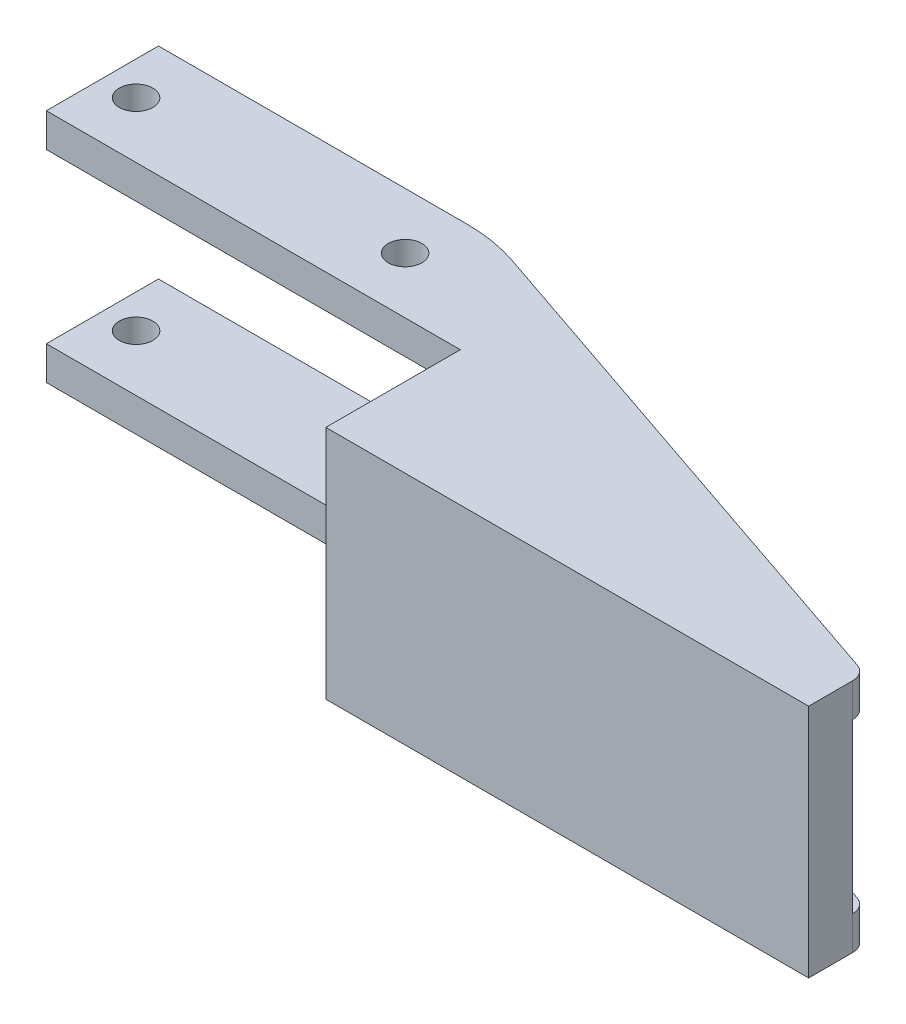
ISO-10303-21;
HEADER;
FILE_DESCRIPTION(('STEP AP214'),'2;1');
FILE_NAME('part.step','',(''),(''),'','','');
FILE_SCHEMA(('AUTOMOTIVE_DESIGN { 1 0 10303 214 1 1 1 1 }'));
ENDSEC;
DATA;
#1=APPLICATION_CONTEXT('core data for automotive mechanical design processes');
#2=APPLICATION_PROTOCOL_DEFINITION('international standard','automotive_design',2000,#1);
#3=PRODUCT_CONTEXT('',#1,'mechanical');
#4=PRODUCT('Part','Part','',(#3));
#5=PRODUCT_RELATED_PRODUCT_CATEGORY('part','',(#4));
#6=PRODUCT_DEFINITION_FORMATION('','',#4);
#7=PRODUCT_DEFINITION_CONTEXT('part definition',#1,'design');
#8=PRODUCT_DEFINITION('design','',#6,#7);
#9=PRODUCT_DEFINITION_SHAPE('','',#8);
#10=(LENGTH_UNIT() NAMED_UNIT(*) SI_UNIT(.MILLI.,.METRE.));
#11=(NAMED_UNIT(*) PLANE_ANGLE_UNIT() SI_UNIT($,.RADIAN.));
#12=(NAMED_UNIT(*) SI_UNIT($,.STERADIAN.) SOLID_ANGLE_UNIT());
#13=UNCERTAINTY_MEASURE_WITH_UNIT(LENGTH_MEASURE(1.E-05),#10,'distance_accuracy_value','');
#14=(GEOMETRIC_REPRESENTATION_CONTEXT(3) GLOBAL_UNCERTAINTY_ASSIGNED_CONTEXT((#13)) GLOBAL_UNIT_ASSIGNED_CONTEXT((#10,
#11,#12)) REPRESENTATION_CONTEXT('',''));
#15=CARTESIAN_POINT('',(0.,0.,0.));
#16=DIRECTION('',(0.,0.,1.));
#17=DIRECTION('',(1.,0.,0.));
#18=AXIS2_PLACEMENT_3D('',#15,#16,#17);
#19=CARTESIAN_POINT('',(-9.406467809383,0.,4.84529828109201));
#20=DIRECTION('',(0.,-1.,0.));
#21=DIRECTION('',(0.,0.,-1.));
#22=AXIS2_PLACEMENT_3D('',#19,#20,#21);
#23=PLANE('',#22);
#24=CARTESIAN_POINT('',(-9.92618806875632,0.,-5.15470171890799));
#25=DIRECTION('',(0.,-1.,0.));
#26=DIRECTION('',(0.,0.,-1.));
#27=AXIS2_PLACEMENT_3D('',#24,#25,#26);
#28=CIRCLE('',#27,1.5);
#29=CARTESIAN_POINT('',(-9.92618806875632,0.,-6.65470171890798));
#30=VERTEX_POINT('',#29);
#31=EDGE_CURVE('E143',#30,#30,#28,.T.);
#32=ORIENTED_EDGE('',*,*,#31,.T.);
#33=EDGE_LOOP('',(#32));
#34=FACE_BOUND('',#33,.T.);
#35=CARTESIAN_POINT('',(-33.9261880687563,0.,-5.15470171890799));
#36=DIRECTION('',(0.,-1.,0.));
#37=DIRECTION('',(0.,0.,-1.));
#38=AXIS2_PLACEMENT_3D('',#35,#36,#37);
#39=CIRCLE('',#38,1.49999999999999);
#40=CARTESIAN_POINT('',(-33.9261880687563,0.,-6.65470171890798));
#41=VERTEX_POINT('',#40);
#42=EDGE_CURVE('E37',#41,#41,#39,.T.);
#43=ORIENTED_EDGE('',*,*,#42,.T.);
#44=EDGE_LOOP('',(#43));
#45=FACE_BOUND('',#44,.T.);
#46=DIRECTION('',(-1.,0.,0.));
#47=VECTOR('',#46,1.);
#48=CARTESIAN_POINT('',(0.,0.,7.91962779227332));
#49=LINE('',#48,#47);
#50=CARTESIAN_POINT('',(43.0738119312437,0.,7.91962779227332));
#51=VERTEX_POINT('',#50);
#52=CARTESIAN_POINT('',(0.,0.,7.91962779227332));
#53=VERTEX_POINT('',#52);
#54=EDGE_CURVE('E181',#51,#53,#49,.T.);
#55=ORIENTED_EDGE('',*,*,#54,.F.);
#56=CARTESIAN_POINT('',(41.5738119312437,0.,7.91962779227332));
#57=DIRECTION('',(0.,1.,0.));
#58=DIRECTION('',(0.,0.,-1.));
#59=AXIS2_PLACEMENT_3D('',#56,#57,#58);
#60=CIRCLE('',#59,1.5);
#61=CARTESIAN_POINT('',(42.0566660311017,0.,6.49946867504375));
#62=VERTEX_POINT('',#61);
#63=EDGE_CURVE('E139',#51,#62,#60,.T.);
#64=ORIENTED_EDGE('',*,*,#63,.T.);
#65=DIRECTION('',(-0.946772744819713,0.,-0.321902733238702));
#66=VECTOR('',#65,1.);
#67=CARTESIAN_POINT('',(-4.57792681080247,0.,-9.35629289120368));
#68=LINE('',#67,#66);
#69=CARTESIAN_POINT('',(-4.57792681080247,0.,-9.35629289120368));
#70=VERTEX_POINT('',#69);
#71=EDGE_CURVE('E142',#62,#70,#68,.T.);
#72=ORIENTED_EDGE('',*,*,#71,.T.);
#73=CARTESIAN_POINT('',(-9.406467809383,0.,4.84529828109201));
#74=DIRECTION('',(0.,1.,0.));
#75=DIRECTION('',(0.,0.,-1.));
#76=AXIS2_PLACEMENT_3D('',#73,#74,#75);
#77=CIRCLE('',#76,15.);
#78=CARTESIAN_POINT('',(-9.406467809383,0.,-10.154701718908));
#79=VERTEX_POINT('',#78);
#80=EDGE_CURVE('E146',#70,#79,#77,.T.);
#81=ORIENTED_EDGE('',*,*,#80,.T.);
#82=DIRECTION('',(-1.,0.,0.));
#83=VECTOR('',#82,1.);
#84=CARTESIAN_POINT('',(-36.9261880687563,0.,-10.154701718908));
#85=LINE('',#84,#83);
#86=CARTESIAN_POINT('',(-36.9261880687563,0.,-10.154701718908));
#87=VERTEX_POINT('',#86);
#88=EDGE_CURVE('E149',#79,#87,#85,.T.);
#89=ORIENTED_EDGE('',*,*,#88,.T.);
#90=DIRECTION('',(0.,0.,1.));
#91=VECTOR('',#90,1.);
#92=CARTESIAN_POINT('',(-36.9261880687563,0.,-10.154701718908));
#93=LINE('',#92,#91);
#94=CARTESIAN_POINT('',(-36.9261880687563,0.,-0.154701718907987));
#95=VERTEX_POINT('',#94);
#96=EDGE_CURVE('E152',#87,#95,#93,.T.);
#97=ORIENTED_EDGE('',*,*,#96,.T.);
#98=DIRECTION('',(1.,0.,0.));
#99=VECTOR('',#98,1.);
#100=CARTESIAN_POINT('',(-36.9261880687563,0.,-0.154701718907987));
#101=LINE('',#100,#99);
#102=CARTESIAN_POINT('',(0.,0.,-0.154701718907987));
#103=VERTEX_POINT('',#102);
#104=EDGE_CURVE('E155',#95,#103,#101,.T.);
#105=ORIENTED_EDGE('',*,*,#104,.T.);
#106=DIRECTION('',(0.,0.,1.));
#107=VECTOR('',#106,1.);
#108=CARTESIAN_POINT('',(0.,0.,11.845298281092));
#109=LINE('',#108,#107);
#110=EDGE_CURVE('E120',#103,#53,#109,.T.);
#111=ORIENTED_EDGE('',*,*,#110,.T.);
#112=EDGE_LOOP('',(#55,#64,#72,#81,#89,#97,#105,#111));
#113=FACE_BOUND('',#112,.T.);
#114=ADVANCED_FACE('F33',(#34,#45,#113),#23,.F.);
#115=CARTESIAN_POINT('',(43.0738119312437,-3.,7.91962779227332));
#116=DIRECTION('',(1.,0.,0.));
#117=DIRECTION('',(0.,0.,-1.));
#118=AXIS2_PLACEMENT_3D('',#115,#116,#117);
#119=PLANE('',#118);
#120=DIRECTION('',(0.,1.,0.));
#121=VECTOR('',#120,1.);
#122=CARTESIAN_POINT('',(43.0738119312437,-3.,7.91962779227332));
#123=LINE('',#122,#121);
#124=CARTESIAN_POINT('',(43.0738119312437,-3.,7.91962779227332));
#125=VERTEX_POINT('',#124);
#126=EDGE_CURVE('E94',#125,#51,#123,.T.);
#127=ORIENTED_EDGE('',*,*,#126,.T.);
#128=DIRECTION('',(0.,-1.,0.));
#129=VECTOR('',#128,1.);
#130=CARTESIAN_POINT('',(43.0738119312437,58.2523313021961,7.91962779227332));
#131=LINE('',#130,#129);
#132=CARTESIAN_POINT('',(43.0738119312437,15.,7.91962779227332));
#133=VERTEX_POINT('',#132);
#134=EDGE_CURVE('E171',#133,#51,#131,.T.);
#135=ORIENTED_EDGE('',*,*,#134,.F.);
#136=DIRECTION('',(0.,-1.,0.));
#137=VECTOR('',#136,1.);
#138=CARTESIAN_POINT('',(43.0738119312437,18.,7.91962779227332));
#139=LINE('',#138,#137);
#140=CARTESIAN_POINT('',(43.0738119312437,18.,7.91962779227332));
#141=VERTEX_POINT('',#140);
#142=EDGE_CURVE('E285',#141,#133,#139,.T.);
#143=ORIENTED_EDGE('',*,*,#142,.F.);
#144=DIRECTION('',(0.,0.,-1.));
#145=VECTOR('',#144,1.);
#146=CARTESIAN_POINT('',(43.0738119312437,18.,7.91962779227332));
#147=LINE('',#146,#145);
#148=CARTESIAN_POINT('',(43.0738119312437,18.,11.845298281092));
#149=VERTEX_POINT('',#148);
#150=EDGE_CURVE('E268',#149,#141,#147,.T.);
#151=ORIENTED_EDGE('',*,*,#150,.F.);
#152=DIRECTION('',(0.,1.,0.));
#153=VECTOR('',#152,1.);
#154=CARTESIAN_POINT('',(43.0738119312437,-3.,11.845298281092));
#155=LINE('',#154,#153);
#156=CARTESIAN_POINT('',(43.0738119312437,-3.,11.845298281092));
#157=VERTEX_POINT('',#156);
#158=EDGE_CURVE('E11',#157,#149,#155,.T.);
#159=ORIENTED_EDGE('',*,*,#158,.F.);
#160=DIRECTION('',(0.,0.,-1.));
#161=VECTOR('',#160,1.);
#162=CARTESIAN_POINT('',(43.0738119312437,-3.,7.91962779227332));
#163=LINE('',#162,#161);
#164=EDGE_CURVE('E157',#157,#125,#163,.T.);
#165=ORIENTED_EDGE('',*,*,#164,.T.);
#166=EDGE_LOOP('',(#127,#135,#143,#151,#159,#165));
#167=FACE_BOUND('',#166,.T.);
#168=ADVANCED_FACE('F35',(#167),#119,.T.);
#169=CARTESIAN_POINT('',(0.,-3.,11.845298281092));
#170=DIRECTION('',(0.,0.,1.));
#171=DIRECTION('',(1.,0.,0.));
#172=AXIS2_PLACEMENT_3D('',#169,#170,#171);
#173=PLANE('',#172);
#174=ORIENTED_EDGE('',*,*,#158,.T.);
#175=DIRECTION('',(1.,0.,0.));
#176=VECTOR('',#175,1.);
#177=CARTESIAN_POINT('',(0.,18.,11.845298281092));
#178=LINE('',#177,#176);
#179=CARTESIAN_POINT('',(0.,18.,11.845298281092));
#180=VERTEX_POINT('',#179);
#181=EDGE_CURVE('E224',#180,#149,#178,.T.);
#182=ORIENTED_EDGE('',*,*,#181,.F.);
#183=DIRECTION('',(0.,1.,0.));
#184=VECTOR('',#183,1.);
#185=CARTESIAN_POINT('',(0.,-3.,11.845298281092));
#186=LINE('',#185,#184);
#187=CARTESIAN_POINT('',(0.,-3.,11.845298281092));
#188=VERTEX_POINT('',#187);
#189=EDGE_CURVE('E43',#188,#180,#186,.T.);
#190=ORIENTED_EDGE('',*,*,#189,.F.);
#191=DIRECTION('',(1.,0.,0.));
#192=VECTOR('',#191,1.);
#193=CARTESIAN_POINT('',(0.,-3.,11.845298281092));
#194=LINE('',#193,#192);
#195=EDGE_CURVE('E129',#188,#157,#194,.T.);
#196=ORIENTED_EDGE('',*,*,#195,.T.);
#197=EDGE_LOOP('',(#174,#182,#190,#196));
#198=FACE_BOUND('',#197,.T.);
#199=ADVANCED_FACE('F219',(#198),#173,.T.);
#200=CARTESIAN_POINT('',(0.,-3.,11.845298281092));
#201=DIRECTION('',(-1.,0.,0.));
#202=DIRECTION('',(0.,0.,1.));
#203=AXIS2_PLACEMENT_3D('',#200,#201,#202);
#204=PLANE('',#203);
#205=ORIENTED_EDGE('',*,*,#110,.F.);
#206=DIRECTION('',(0.,1.,0.));
#207=VECTOR('',#206,1.);
#208=CARTESIAN_POINT('',(0.,-3.,-0.154701718907987));
#209=LINE('',#208,#207);
#210=CARTESIAN_POINT('',(0.,-3.,-0.154701718907987));
#211=VERTEX_POINT('',#210);
#212=EDGE_CURVE('E85',#211,#103,#209,.T.);
#213=ORIENTED_EDGE('',*,*,#212,.F.);
#214=DIRECTION('',(0.,0.,1.));
#215=VECTOR('',#214,1.);
#216=CARTESIAN_POINT('',(0.,-3.,11.845298281092));
#217=LINE('',#216,#215);
#218=EDGE_CURVE('E116',#211,#188,#217,.T.);
#219=ORIENTED_EDGE('',*,*,#218,.T.);
#220=ORIENTED_EDGE('',*,*,#189,.T.);
#221=DIRECTION('',(0.,0.,1.));
#222=VECTOR('',#221,1.);
#223=CARTESIAN_POINT('',(0.,18.,11.845298281092));
#224=LINE('',#223,#222);
#225=CARTESIAN_POINT('',(0.,18.,-0.154701718907987));
#226=VERTEX_POINT('',#225);
#227=EDGE_CURVE('E229',#226,#180,#224,.T.);
#228=ORIENTED_EDGE('',*,*,#227,.F.);
#229=DIRECTION('',(0.,-1.,0.));
#230=VECTOR('',#229,1.);
#231=CARTESIAN_POINT('',(0.,18.,-0.154701718907987));
#232=LINE('',#231,#230);
#233=CARTESIAN_POINT('',(0.,15.,-0.154701718907987));
#234=VERTEX_POINT('',#233);
#235=EDGE_CURVE('E240',#226,#234,#232,.T.);
#236=ORIENTED_EDGE('',*,*,#235,.T.);
#237=DIRECTION('',(0.,0.,1.));
#238=VECTOR('',#237,1.);
#239=CARTESIAN_POINT('',(0.,15.,11.845298281092));
#240=LINE('',#239,#238);
#241=CARTESIAN_POINT('',(0.,15.,7.91962779227332));
#242=VERTEX_POINT('',#241);
#243=EDGE_CURVE('E265',#234,#242,#240,.T.);
#244=ORIENTED_EDGE('',*,*,#243,.T.);
#245=DIRECTION('',(0.,-1.,0.));
#246=VECTOR('',#245,1.);
#247=CARTESIAN_POINT('',(0.,58.2523313021961,7.91962779227332));
#248=LINE('',#247,#246);
#249=EDGE_CURVE('E184',#242,#53,#248,.T.);
#250=ORIENTED_EDGE('',*,*,#249,.T.);
#251=EDGE_LOOP('',(#205,#213,#219,#220,#228,#236,#244,#250));
#252=FACE_BOUND('',#251,.T.);
#253=ADVANCED_FACE('F114',(#252),#204,.T.);
#254=CARTESIAN_POINT('',(-36.9261880687563,-3.,-0.154701718907987));
#255=DIRECTION('',(0.,0.,1.));
#256=DIRECTION('',(1.,0.,0.));
#257=AXIS2_PLACEMENT_3D('',#254,#255,#256);
#258=PLANE('',#257);
#259=ORIENTED_EDGE('',*,*,#104,.F.);
#260=DIRECTION('',(0.,1.,0.));
#261=VECTOR('',#260,1.);
#262=CARTESIAN_POINT('',(-36.9261880687563,-3.,-0.154701718907987));
#263=LINE('',#262,#261);
#264=CARTESIAN_POINT('',(-36.9261880687563,-3.,-0.154701718907987));
#265=VERTEX_POINT('',#264);
#266=EDGE_CURVE('E78',#265,#95,#263,.T.);
#267=ORIENTED_EDGE('',*,*,#266,.F.);
#268=DIRECTION('',(1.,0.,0.));
#269=VECTOR('',#268,1.);
#270=CARTESIAN_POINT('',(-36.9261880687563,-3.,-0.154701718907987));
#271=LINE('',#270,#269);
#272=EDGE_CURVE('E127',#265,#211,#271,.T.);
#273=ORIENTED_EDGE('',*,*,#272,.T.);
#274=ORIENTED_EDGE('',*,*,#212,.T.);
#275=EDGE_LOOP('',(#259,#267,#273,#274));
#276=FACE_BOUND('',#275,.T.);
#277=ADVANCED_FACE('F131',(#276),#258,.T.);
#278=CARTESIAN_POINT('',(-36.9261880687563,-3.,-10.154701718908));
#279=DIRECTION('',(-1.,0.,0.));
#280=DIRECTION('',(0.,0.,1.));
#281=AXIS2_PLACEMENT_3D('',#278,#279,#280);
#282=PLANE('',#281);
#283=ORIENTED_EDGE('',*,*,#96,.F.);
#284=DIRECTION('',(0.,1.,0.));
#285=VECTOR('',#284,1.);
#286=CARTESIAN_POINT('',(-36.9261880687563,-3.,-10.154701718908));
#287=LINE('',#286,#285);
#288=CARTESIAN_POINT('',(-36.9261880687563,-3.,-10.154701718908));
#289=VERTEX_POINT('',#288);
#290=EDGE_CURVE('E161',#289,#87,#287,.T.);
#291=ORIENTED_EDGE('',*,*,#290,.F.);
#292=DIRECTION('',(0.,0.,1.));
#293=VECTOR('',#292,1.);
#294=CARTESIAN_POINT('',(-36.9261880687563,-3.,-10.154701718908));
#295=LINE('',#294,#293);
#296=EDGE_CURVE('E132',#289,#265,#295,.T.);
#297=ORIENTED_EDGE('',*,*,#296,.T.);
#298=ORIENTED_EDGE('',*,*,#266,.T.);
#299=EDGE_LOOP('',(#283,#291,#297,#298));
#300=FACE_BOUND('',#299,.T.);
#301=ADVANCED_FACE('F398',(#300),#282,.T.);
#302=CARTESIAN_POINT('',(-36.9261880687563,-3.,-10.154701718908));
#303=DIRECTION('',(0.,0.,-1.));
#304=DIRECTION('',(-1.,0.,0.));
#305=AXIS2_PLACEMENT_3D('',#302,#303,#304);
#306=PLANE('',#305);
#307=ORIENTED_EDGE('',*,*,#88,.F.);
#308=DIRECTION('',(0.,1.,0.));
#309=VECTOR('',#308,1.);
#310=CARTESIAN_POINT('',(-9.406467809383,-3.,-10.154701718908));
#311=LINE('',#310,#309);
#312=CARTESIAN_POINT('',(-9.406467809383,-3.,-10.154701718908));
#313=VERTEX_POINT('',#312);
#314=EDGE_CURVE('E163',#313,#79,#311,.T.);
#315=ORIENTED_EDGE('',*,*,#314,.F.);
#316=DIRECTION('',(-1.,0.,0.));
#317=VECTOR('',#316,1.);
#318=CARTESIAN_POINT('',(-36.9261880687563,-3.,-10.154701718908));
#319=LINE('',#318,#317);
#320=EDGE_CURVE('E134',#313,#289,#319,.T.);
#321=ORIENTED_EDGE('',*,*,#320,.T.);
#322=ORIENTED_EDGE('',*,*,#290,.T.);
#323=EDGE_LOOP('',(#307,#315,#321,#322));
#324=FACE_BOUND('',#323,.T.);
#325=ADVANCED_FACE('F210',(#324),#306,.T.);
#326=CARTESIAN_POINT('',(-9.406467809383,-3.,4.84529828109201));
#327=DIRECTION('',(0.,1.,0.));
#328=DIRECTION('',(0.,0.,1.));
#329=AXIS2_PLACEMENT_3D('',#326,#327,#328);
#330=CYLINDRICAL_SURFACE('',#329,15.);
#331=ORIENTED_EDGE('',*,*,#80,.F.);
#332=DIRECTION('',(0.,1.,0.));
#333=VECTOR('',#332,1.);
#334=CARTESIAN_POINT('',(-4.57792681080247,-3.,-9.35629289120368));
#335=LINE('',#334,#333);
#336=CARTESIAN_POINT('',(-4.57792681080247,-3.,-9.35629289120368));
#337=VERTEX_POINT('',#336);
#338=EDGE_CURVE('E165',#337,#70,#335,.T.);
#339=ORIENTED_EDGE('',*,*,#338,.F.);
#340=CARTESIAN_POINT('',(-9.406467809383,-3.,4.84529828109201));
#341=DIRECTION('',(0.,1.,0.));
#342=DIRECTION('',(0.,0.,-1.));
#343=AXIS2_PLACEMENT_3D('',#340,#341,#342);
#344=CIRCLE('',#343,15.);
#345=EDGE_CURVE('E204',#337,#313,#344,.T.);
#346=ORIENTED_EDGE('',*,*,#345,.T.);
#347=ORIENTED_EDGE('',*,*,#314,.T.);
#348=EDGE_LOOP('',(#331,#339,#346,#347));
#349=FACE_BOUND('',#348,.T.);
#350=ADVANCED_FACE('F215',(#349),#330,.T.);
#351=CARTESIAN_POINT('',(-4.57792681080247,-3.,-9.35629289120368));
#352=DIRECTION('',(0.321902733238702,0.,-0.946772744819713));
#353=DIRECTION('',(-0.946772744819713,0.,-0.321902733238702));
#354=AXIS2_PLACEMENT_3D('',#351,#352,#353);
#355=PLANE('',#354);
#356=ORIENTED_EDGE('',*,*,#71,.F.);
#357=DIRECTION('',(0.,1.,0.));
#358=VECTOR('',#357,1.);
#359=CARTESIAN_POINT('',(42.0566660311017,-3.,6.49946867504375));
#360=LINE('',#359,#358);
#361=CARTESIAN_POINT('',(42.0566660311017,-3.,6.49946867504375));
#362=VERTEX_POINT('',#361);
#363=EDGE_CURVE('E167',#362,#62,#360,.T.);
#364=ORIENTED_EDGE('',*,*,#363,.F.);
#365=DIRECTION('',(-0.946772744819713,0.,-0.321902733238702));
#366=VECTOR('',#365,1.);
#367=CARTESIAN_POINT('',(-4.57792681080247,-3.,-9.35629289120368));
#368=LINE('',#367,#366);
#369=EDGE_CURVE('E201',#362,#337,#368,.T.);
#370=ORIENTED_EDGE('',*,*,#369,.T.);
#371=ORIENTED_EDGE('',*,*,#338,.T.);
#372=EDGE_LOOP('',(#356,#364,#370,#371));
#373=FACE_BOUND('',#372,.T.);
#374=ADVANCED_FACE('F217',(#373),#355,.T.);
#375=CARTESIAN_POINT('',(41.5738119312437,-3.,7.91962779227332));
#376=DIRECTION('',(0.,1.,0.));
#377=DIRECTION('',(0.,0.,1.));
#378=AXIS2_PLACEMENT_3D('',#375,#376,#377);
#379=CYLINDRICAL_SURFACE('',#378,1.5);
#380=ORIENTED_EDGE('',*,*,#63,.F.);
#381=ORIENTED_EDGE('',*,*,#126,.F.);
#382=CARTESIAN_POINT('',(41.5738119312437,-3.,7.91962779227332));
#383=DIRECTION('',(0.,1.,0.));
#384=DIRECTION('',(0.,0.,-1.));
#385=AXIS2_PLACEMENT_3D('',#382,#383,#384);
#386=CIRCLE('',#385,1.5);
#387=EDGE_CURVE('E199',#125,#362,#386,.T.);
#388=ORIENTED_EDGE('',*,*,#387,.T.);
#389=ORIENTED_EDGE('',*,*,#363,.T.);
#390=EDGE_LOOP('',(#380,#381,#388,#389));
#391=FACE_BOUND('',#390,.T.);
#392=ADVANCED_FACE('F173',(#391),#379,.T.);
#393=CARTESIAN_POINT('',(-9.406467809383,-3.,4.84529828109201));
#394=DIRECTION('',(0.,-1.,0.));
#395=DIRECTION('',(0.,0.,-1.));
#396=AXIS2_PLACEMENT_3D('',#393,#394,#395);
#397=PLANE('',#396);
#398=CARTESIAN_POINT('',(-33.9261880687563,-3.,-5.15470171890799));
#399=DIRECTION('',(0.,-1.,0.));
#400=DIRECTION('',(0.,0.,-1.));
#401=AXIS2_PLACEMENT_3D('',#398,#399,#400);
#402=CIRCLE('',#401,1.49999999999999);
#403=CARTESIAN_POINT('',(-33.9261880687563,-3.,-6.65470171890798));
#404=VERTEX_POINT('',#403);
#405=EDGE_CURVE('E186',#404,#404,#402,.T.);
#406=ORIENTED_EDGE('',*,*,#405,.F.);
#407=EDGE_LOOP('',(#406));
#408=FACE_BOUND('',#407,.T.);
#409=CARTESIAN_POINT('',(-9.92618806875632,-3.,-5.15470171890799));
#410=DIRECTION('',(0.,-1.,0.));
#411=DIRECTION('',(0.,0.,-1.));
#412=AXIS2_PLACEMENT_3D('',#409,#410,#411);
#413=CIRCLE('',#412,1.5);
#414=CARTESIAN_POINT('',(-9.92618806875632,-3.,-6.65470171890798));
#415=VERTEX_POINT('',#414);
#416=EDGE_CURVE('E193',#415,#415,#413,.T.);
#417=ORIENTED_EDGE('',*,*,#416,.F.);
#418=EDGE_LOOP('',(#417));
#419=FACE_BOUND('',#418,.T.);
#420=ORIENTED_EDGE('',*,*,#164,.F.);
#421=ORIENTED_EDGE('',*,*,#195,.F.);
#422=ORIENTED_EDGE('',*,*,#218,.F.);
#423=ORIENTED_EDGE('',*,*,#272,.F.);
#424=ORIENTED_EDGE('',*,*,#296,.F.);
#425=ORIENTED_EDGE('',*,*,#320,.F.);
#426=ORIENTED_EDGE('',*,*,#345,.F.);
#427=ORIENTED_EDGE('',*,*,#369,.F.);
#428=ORIENTED_EDGE('',*,*,#387,.F.);
#429=EDGE_LOOP('',(#420,#421,#422,#423,#424,#425,#426,#427,#428));
#430=FACE_BOUND('',#429,.T.);
#431=ADVANCED_FACE('F125',(#408,#419,#430),#397,.T.);
#432=CARTESIAN_POINT('',(-9.92618806875632,-3.,-5.15470171890799));
#433=DIRECTION('',(0.,-1.,0.));
#434=DIRECTION('',(0.,0.,-1.));
#435=AXIS2_PLACEMENT_3D('',#432,#433,#434);
#436=CYLINDRICAL_SURFACE('',#435,1.5);
#437=ORIENTED_EDGE('',*,*,#416,.T.);
#438=EDGE_LOOP('',(#437));
#439=FACE_BOUND('',#438,.T.);
#440=ORIENTED_EDGE('',*,*,#31,.F.);
#441=EDGE_LOOP('',(#440));
#442=FACE_BOUND('',#441,.T.);
#443=ADVANCED_FACE('F410',(#439,#442),#436,.F.);
#444=CARTESIAN_POINT('',(-33.9261880687563,-3.,-5.15470171890799));
#445=DIRECTION('',(0.,-1.,0.));
#446=DIRECTION('',(0.,0.,-1.));
#447=AXIS2_PLACEMENT_3D('',#444,#445,#446);
#448=CYLINDRICAL_SURFACE('',#447,1.49999999999999);
#449=ORIENTED_EDGE('',*,*,#405,.T.);
#450=EDGE_LOOP('',(#449));
#451=FACE_BOUND('',#450,.T.);
#452=ORIENTED_EDGE('',*,*,#42,.F.);
#453=EDGE_LOOP('',(#452));
#454=FACE_BOUND('',#453,.T.);
#455=ADVANCED_FACE('F415',(#451,#454),#448,.F.);
#456=CARTESIAN_POINT('',(0.,58.2523313021961,7.91962779227332));
#457=DIRECTION('',(0.,0.,1.));
#458=DIRECTION('',(1.,0.,0.));
#459=AXIS2_PLACEMENT_3D('',#456,#457,#458);
#460=PLANE('',#459);
#461=ORIENTED_EDGE('',*,*,#249,.F.);
#462=DIRECTION('',(1.,0.,0.));
#463=VECTOR('',#462,1.);
#464=CARTESIAN_POINT('',(0.,15.,7.91962779227332));
#465=LINE('',#464,#463);
#466=EDGE_CURVE('E183',#242,#133,#465,.T.);
#467=ORIENTED_EDGE('',*,*,#466,.T.);
#468=ORIENTED_EDGE('',*,*,#134,.T.);
#469=ORIENTED_EDGE('',*,*,#54,.T.);
#470=EDGE_LOOP('',(#461,#467,#468,#469));
#471=FACE_BOUND('',#470,.T.);
#472=ADVANCED_FACE('F179',(#471),#460,.F.);
#473=CARTESIAN_POINT('',(-9.406467809383,15.,4.84529828109201));
#474=DIRECTION('',(0.,-1.,0.));
#475=DIRECTION('',(0.,0.,-1.));
#476=AXIS2_PLACEMENT_3D('',#473,#474,#475);
#477=PLANE('',#476);
#478=CARTESIAN_POINT('',(-9.92618806875632,15.,-5.15470171890799));
#479=DIRECTION('',(0.,-1.,0.));
#480=DIRECTION('',(0.,0.,-1.));
#481=AXIS2_PLACEMENT_3D('',#478,#479,#480);
#482=CIRCLE('',#481,1.5);
#483=CARTESIAN_POINT('',(-9.92618806875632,15.,-6.65470171890798));
#484=VERTEX_POINT('',#483);
#485=EDGE_CURVE('E250',#484,#484,#482,.T.);
#486=ORIENTED_EDGE('',*,*,#485,.F.);
#487=EDGE_LOOP('',(#486));
#488=FACE_BOUND('',#487,.T.);
#489=CARTESIAN_POINT('',(-33.9261880687563,15.,-5.15470171890799));
#490=DIRECTION('',(0.,-1.,0.));
#491=DIRECTION('',(0.,0.,-1.));
#492=AXIS2_PLACEMENT_3D('',#489,#490,#491);
#493=CIRCLE('',#492,1.49999999999999);
#494=CARTESIAN_POINT('',(-33.9261880687563,15.,-6.65470171890798));
#495=VERTEX_POINT('',#494);
#496=EDGE_CURVE('E291',#495,#495,#493,.T.);
#497=ORIENTED_EDGE('',*,*,#496,.F.);
#498=EDGE_LOOP('',(#497));
#499=FACE_BOUND('',#498,.T.);
#500=ORIENTED_EDGE('',*,*,#466,.F.);
#501=ORIENTED_EDGE('',*,*,#243,.F.);
#502=DIRECTION('',(1.,0.,0.));
#503=VECTOR('',#502,1.);
#504=CARTESIAN_POINT('',(-36.9261880687563,15.,-0.154701718907987));
#505=LINE('',#504,#503);
#506=CARTESIAN_POINT('',(-36.9261880687563,15.,-0.154701718907987));
#507=VERTEX_POINT('',#506);
#508=EDGE_CURVE('E262',#507,#234,#505,.T.);
#509=ORIENTED_EDGE('',*,*,#508,.F.);
#510=DIRECTION('',(0.,0.,1.));
#511=VECTOR('',#510,1.);
#512=CARTESIAN_POINT('',(-36.9261880687563,15.,-10.154701718908));
#513=LINE('',#512,#511);
#514=CARTESIAN_POINT('',(-36.9261880687563,15.,-10.154701718908));
#515=VERTEX_POINT('',#514);
#516=EDGE_CURVE('E259',#515,#507,#513,.T.);
#517=ORIENTED_EDGE('',*,*,#516,.F.);
#518=DIRECTION('',(-1.,0.,0.));
#519=VECTOR('',#518,1.);
#520=CARTESIAN_POINT('',(-36.9261880687563,15.,-10.154701718908));
#521=LINE('',#520,#519);
#522=CARTESIAN_POINT('',(-9.406467809383,15.,-10.154701718908));
#523=VERTEX_POINT('',#522);
#524=EDGE_CURVE('E256',#523,#515,#521,.T.);
#525=ORIENTED_EDGE('',*,*,#524,.F.);
#526=CARTESIAN_POINT('',(-9.406467809383,15.,4.84529828109201));
#527=DIRECTION('',(0.,1.,0.));
#528=DIRECTION('',(0.,0.,-1.));
#529=AXIS2_PLACEMENT_3D('',#526,#527,#528);
#530=CIRCLE('',#529,15.);
#531=CARTESIAN_POINT('',(-4.57792681080247,15.,-9.35629289120368));
#532=VERTEX_POINT('',#531);
#533=EDGE_CURVE('E253',#532,#523,#530,.T.);
#534=ORIENTED_EDGE('',*,*,#533,.F.);
#535=DIRECTION('',(-0.946772744819713,0.,-0.321902733238702));
#536=VECTOR('',#535,1.);
#537=CARTESIAN_POINT('',(-4.57792681080247,15.,-9.35629289120368));
#538=LINE('',#537,#536);
#539=CARTESIAN_POINT('',(42.0566660311017,15.,6.49946867504375));
#540=VERTEX_POINT('',#539);
#541=EDGE_CURVE('E249',#540,#532,#538,.T.);
#542=ORIENTED_EDGE('',*,*,#541,.F.);
#543=CARTESIAN_POINT('',(41.5738119312437,15.,7.91962779227332));
#544=DIRECTION('',(0.,1.,0.));
#545=DIRECTION('',(0.,0.,-1.));
#546=AXIS2_PLACEMENT_3D('',#543,#544,#545);
#547=CIRCLE('',#546,1.5);
#548=EDGE_CURVE('E246',#133,#540,#547,.T.);
#549=ORIENTED_EDGE('',*,*,#548,.F.);
#550=EDGE_LOOP('',(#500,#501,#509,#517,#525,#534,#542,#549));
#551=FACE_BOUND('',#550,.T.);
#552=ADVANCED_FACE('F336',(#488,#499,#551),#477,.T.);
#553=CARTESIAN_POINT('',(41.5738119312437,18.,7.91962779227332));
#554=DIRECTION('',(0.,-1.,0.));
#555=DIRECTION('',(0.,0.,-1.));
#556=AXIS2_PLACEMENT_3D('',#553,#554,#555);
#557=CYLINDRICAL_SURFACE('',#556,1.5);
#558=ORIENTED_EDGE('',*,*,#548,.T.);
#559=DIRECTION('',(0.,-1.,0.));
#560=VECTOR('',#559,1.);
#561=CARTESIAN_POINT('',(42.0566660311017,18.,6.49946867504375));
#562=LINE('',#561,#560);
#563=CARTESIAN_POINT('',(42.0566660311017,18.,6.49946867504375));
#564=VERTEX_POINT('',#563);
#565=EDGE_CURVE('E282',#564,#540,#562,.T.);
#566=ORIENTED_EDGE('',*,*,#565,.F.);
#567=CARTESIAN_POINT('',(41.5738119312437,18.,7.91962779227332));
#568=DIRECTION('',(0.,1.,0.));
#569=DIRECTION('',(0.,0.,-1.));
#570=AXIS2_PLACEMENT_3D('',#567,#568,#569);
#571=CIRCLE('',#570,1.5);
#572=EDGE_CURVE('E304',#141,#564,#571,.T.);
#573=ORIENTED_EDGE('',*,*,#572,.F.);
#574=ORIENTED_EDGE('',*,*,#142,.T.);
#575=EDGE_LOOP('',(#558,#566,#573,#574));
#576=FACE_BOUND('',#575,.T.);
#577=ADVANCED_FACE('F361',(#576),#557,.T.);
#578=CARTESIAN_POINT('',(-4.57792681080247,18.,-9.35629289120368));
#579=DIRECTION('',(-0.321902733238702,0.,0.946772744819713));
#580=DIRECTION('',(0.946772744819713,0.,0.321902733238702));
#581=AXIS2_PLACEMENT_3D('',#578,#579,#580);
#582=PLANE('',#581);
#583=ORIENTED_EDGE('',*,*,#541,.T.);
#584=DIRECTION('',(0.,-1.,0.));
#585=VECTOR('',#584,1.);
#586=CARTESIAN_POINT('',(-4.57792681080247,18.,-9.35629289120368));
#587=LINE('',#586,#585);
#588=CARTESIAN_POINT('',(-4.57792681080247,18.,-9.35629289120368));
#589=VERTEX_POINT('',#588);
#590=EDGE_CURVE('E279',#589,#532,#587,.T.);
#591=ORIENTED_EDGE('',*,*,#590,.F.);
#592=DIRECTION('',(-0.946772744819713,0.,-0.321902733238702));
#593=VECTOR('',#592,1.);
#594=CARTESIAN_POINT('',(-4.57792681080247,18.,-9.35629289120368));
#595=LINE('',#594,#593);
#596=EDGE_CURVE('E307',#564,#589,#595,.T.);
#597=ORIENTED_EDGE('',*,*,#596,.F.);
#598=ORIENTED_EDGE('',*,*,#565,.T.);
#599=EDGE_LOOP('',(#583,#591,#597,#598));
#600=FACE_BOUND('',#599,.T.);
#601=ADVANCED_FACE('F367',(#600),#582,.F.);
#602=CARTESIAN_POINT('',(-9.406467809383,18.,4.84529828109201));
#603=DIRECTION('',(0.,-1.,0.));
#604=DIRECTION('',(0.,0.,-1.));
#605=AXIS2_PLACEMENT_3D('',#602,#603,#604);
#606=CYLINDRICAL_SURFACE('',#605,15.);
#607=ORIENTED_EDGE('',*,*,#533,.T.);
#608=DIRECTION('',(0.,-1.,0.));
#609=VECTOR('',#608,1.);
#610=CARTESIAN_POINT('',(-9.406467809383,18.,-10.154701718908));
#611=LINE('',#610,#609);
#612=CARTESIAN_POINT('',(-9.406467809383,18.,-10.154701718908));
#613=VERTEX_POINT('',#612);
#614=EDGE_CURVE('E276',#613,#523,#611,.T.);
#615=ORIENTED_EDGE('',*,*,#614,.F.);
#616=CARTESIAN_POINT('',(-9.406467809383,18.,4.84529828109201));
#617=DIRECTION('',(0.,1.,0.));
#618=DIRECTION('',(0.,0.,-1.));
#619=AXIS2_PLACEMENT_3D('',#616,#617,#618);
#620=CIRCLE('',#619,15.);
#621=EDGE_CURVE('E310',#589,#613,#620,.T.);
#622=ORIENTED_EDGE('',*,*,#621,.F.);
#623=ORIENTED_EDGE('',*,*,#590,.T.);
#624=EDGE_LOOP('',(#607,#615,#622,#623));
#625=FACE_BOUND('',#624,.T.);
#626=ADVANCED_FACE('F370',(#625),#606,.T.);
#627=CARTESIAN_POINT('',(-36.9261880687563,18.,-10.154701718908));
#628=DIRECTION('',(0.,0.,1.));
#629=DIRECTION('',(1.,0.,0.));
#630=AXIS2_PLACEMENT_3D('',#627,#628,#629);
#631=PLANE('',#630);
#632=ORIENTED_EDGE('',*,*,#524,.T.);
#633=DIRECTION('',(0.,-1.,0.));
#634=VECTOR('',#633,1.);
#635=CARTESIAN_POINT('',(-36.9261880687563,18.,-10.154701718908));
#636=LINE('',#635,#634);
#637=CARTESIAN_POINT('',(-36.9261880687563,18.,-10.154701718908));
#638=VERTEX_POINT('',#637);
#639=EDGE_CURVE('E273',#638,#515,#636,.T.);
#640=ORIENTED_EDGE('',*,*,#639,.F.);
#641=DIRECTION('',(-1.,0.,0.));
#642=VECTOR('',#641,1.);
#643=CARTESIAN_POINT('',(-36.9261880687563,18.,-10.154701718908));
#644=LINE('',#643,#642);
#645=EDGE_CURVE('E313',#613,#638,#644,.T.);
#646=ORIENTED_EDGE('',*,*,#645,.F.);
#647=ORIENTED_EDGE('',*,*,#614,.T.);
#648=EDGE_LOOP('',(#632,#640,#646,#647));
#649=FACE_BOUND('',#648,.T.);
#650=ADVANCED_FACE('F373',(#649),#631,.F.);
#651=CARTESIAN_POINT('',(-36.9261880687563,18.,-10.154701718908));
#652=DIRECTION('',(1.,0.,0.));
#653=DIRECTION('',(0.,0.,-1.));
#654=AXIS2_PLACEMENT_3D('',#651,#652,#653);
#655=PLANE('',#654);
#656=ORIENTED_EDGE('',*,*,#516,.T.);
#657=DIRECTION('',(0.,-1.,0.));
#658=VECTOR('',#657,1.);
#659=CARTESIAN_POINT('',(-36.9261880687563,18.,-0.154701718907987));
#660=LINE('',#659,#658);
#661=CARTESIAN_POINT('',(-36.9261880687563,18.,-0.154701718907987));
#662=VERTEX_POINT('',#661);
#663=EDGE_CURVE('E270',#662,#507,#660,.T.);
#664=ORIENTED_EDGE('',*,*,#663,.F.);
#665=DIRECTION('',(0.,0.,1.));
#666=VECTOR('',#665,1.);
#667=CARTESIAN_POINT('',(-36.9261880687563,18.,-10.154701718908));
#668=LINE('',#667,#666);
#669=EDGE_CURVE('E242',#638,#662,#668,.T.);
#670=ORIENTED_EDGE('',*,*,#669,.F.);
#671=ORIENTED_EDGE('',*,*,#639,.T.);
#672=EDGE_LOOP('',(#656,#664,#670,#671));
#673=FACE_BOUND('',#672,.T.);
#674=ADVANCED_FACE('F323',(#673),#655,.F.);
#675=CARTESIAN_POINT('',(-36.9261880687563,18.,-0.154701718907987));
#676=DIRECTION('',(0.,0.,-1.));
#677=DIRECTION('',(-1.,0.,0.));
#678=AXIS2_PLACEMENT_3D('',#675,#676,#677);
#679=PLANE('',#678);
#680=ORIENTED_EDGE('',*,*,#508,.T.);
#681=ORIENTED_EDGE('',*,*,#235,.F.);
#682=DIRECTION('',(1.,0.,0.));
#683=VECTOR('',#682,1.);
#684=CARTESIAN_POINT('',(-36.9261880687563,18.,-0.154701718907987));
#685=LINE('',#684,#683);
#686=EDGE_CURVE('E237',#662,#226,#685,.T.);
#687=ORIENTED_EDGE('',*,*,#686,.F.);
#688=ORIENTED_EDGE('',*,*,#663,.T.);
#689=EDGE_LOOP('',(#680,#681,#687,#688));
#690=FACE_BOUND('',#689,.T.);
#691=ADVANCED_FACE('F328',(#690),#679,.F.);
#692=CARTESIAN_POINT('',(-9.406467809383,18.,4.84529828109201));
#693=DIRECTION('',(0.,-1.,0.));
#694=DIRECTION('',(0.,0.,-1.));
#695=AXIS2_PLACEMENT_3D('',#692,#693,#694);
#696=PLANE('',#695);
#697=CARTESIAN_POINT('',(-33.9261880687563,18.,-5.15470171890799));
#698=DIRECTION('',(0.,-1.,0.));
#699=DIRECTION('',(0.,0.,-1.));
#700=AXIS2_PLACEMENT_3D('',#697,#698,#699);
#701=CIRCLE('',#700,1.49999999999999);
#702=CARTESIAN_POINT('',(-33.9261880687563,18.,-6.65470171890798));
#703=VERTEX_POINT('',#702);
#704=EDGE_CURVE('E293',#703,#703,#701,.T.);
#705=ORIENTED_EDGE('',*,*,#704,.T.);
#706=EDGE_LOOP('',(#705));
#707=FACE_BOUND('',#706,.T.);
#708=CARTESIAN_POINT('',(-9.92618806875632,18.,-5.15470171890799));
#709=DIRECTION('',(0.,-1.,0.));
#710=DIRECTION('',(0.,0.,-1.));
#711=AXIS2_PLACEMENT_3D('',#708,#709,#710);
#712=CIRCLE('',#711,1.49999999999999);
#713=CARTESIAN_POINT('',(-9.92618806875632,18.,-6.65470171890798));
#714=VERTEX_POINT('',#713);
#715=EDGE_CURVE('E290',#714,#714,#712,.T.);
#716=ORIENTED_EDGE('',*,*,#715,.T.);
#717=EDGE_LOOP('',(#716));
#718=FACE_BOUND('',#717,.T.);
#719=ORIENTED_EDGE('',*,*,#150,.T.);
#720=ORIENTED_EDGE('',*,*,#572,.T.);
#721=ORIENTED_EDGE('',*,*,#596,.T.);
#722=ORIENTED_EDGE('',*,*,#621,.T.);
#723=ORIENTED_EDGE('',*,*,#645,.T.);
#724=ORIENTED_EDGE('',*,*,#669,.T.);
#725=ORIENTED_EDGE('',*,*,#686,.T.);
#726=ORIENTED_EDGE('',*,*,#227,.T.);
#727=ORIENTED_EDGE('',*,*,#181,.T.);
#728=EDGE_LOOP('',(#719,#720,#721,#722,#723,#724,#725,#726,#727));
#729=FACE_BOUND('',#728,.T.);
#730=ADVANCED_FACE('F234',(#707,#718,#729),#696,.F.);
#731=CARTESIAN_POINT('',(-9.92618806875632,-3.,-5.15470171890799));
#732=DIRECTION('',(0.,-1.,0.));
#733=DIRECTION('',(0.,0.,-1.));
#734=AXIS2_PLACEMENT_3D('',#731,#732,#733);
#735=CYLINDRICAL_SURFACE('',#734,1.5);
#736=ORIENTED_EDGE('',*,*,#485,.T.);
#737=EDGE_LOOP('',(#736));
#738=FACE_BOUND('',#737,.T.);
#739=ORIENTED_EDGE('',*,*,#715,.F.);
#740=EDGE_LOOP('',(#739));
#741=FACE_BOUND('',#740,.T.);
#742=ADVANCED_FACE('F472',(#738,#741),#735,.F.);
#743=CARTESIAN_POINT('',(-33.9261880687563,-3.,-5.15470171890799));
#744=DIRECTION('',(0.,-1.,0.));
#745=DIRECTION('',(0.,0.,-1.));
#746=AXIS2_PLACEMENT_3D('',#743,#744,#745);
#747=CYLINDRICAL_SURFACE('',#746,1.49999999999999);
#748=ORIENTED_EDGE('',*,*,#496,.T.);
#749=EDGE_LOOP('',(#748));
#750=FACE_BOUND('',#749,.T.);
#751=ORIENTED_EDGE('',*,*,#704,.F.);
#752=EDGE_LOOP('',(#751));
#753=FACE_BOUND('',#752,.T.);
#754=ADVANCED_FACE('F481',(#750,#753),#747,.F.);
#755=CLOSED_SHELL('',(#114,#168,#199,#253,#277,#301,#325,#350,#374,#392,#431,#443,#455,#472,
#552,#577,#601,#626,#650,#674,#691,#730,#742,#754));
#756=MANIFOLD_SOLID_BREP('B2',#755);
#757=ADVANCED_BREP_SHAPE_REPRESENTATION('',(#18,#756),#14);
#758=SHAPE_DEFINITION_REPRESENTATION(#9,#757);
ENDSEC;
END-ISO-10303-21;
